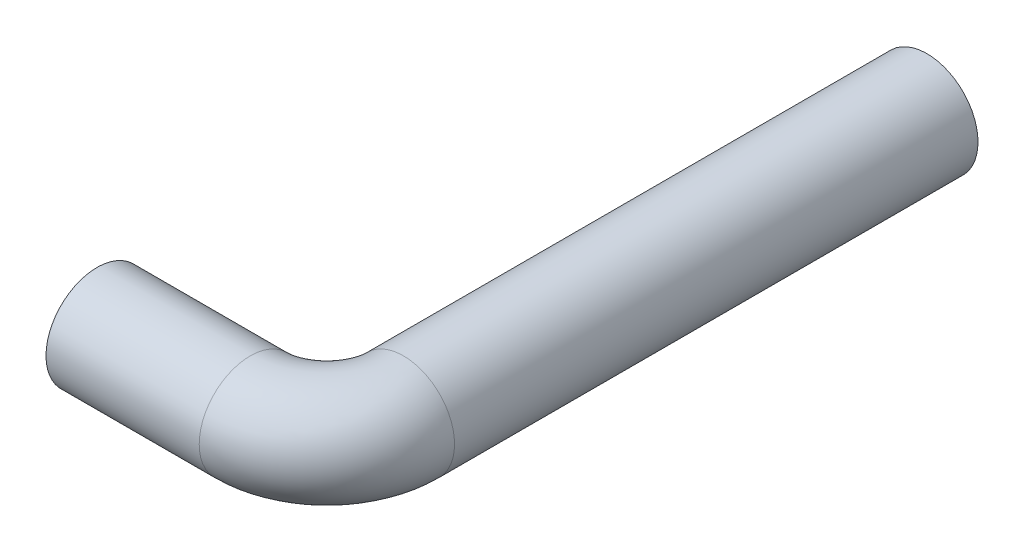
ISO-10303-21;
HEADER;
FILE_DESCRIPTION(('STEP AP214'),'2;1');
FILE_NAME('part.step','',(''),(''),'','','');
FILE_SCHEMA(('AUTOMOTIVE_DESIGN { 1 0 10303 214 1 1 1 1 }'));
ENDSEC;
DATA;
#1=APPLICATION_CONTEXT('core data for automotive mechanical design processes');
#2=APPLICATION_PROTOCOL_DEFINITION('international standard','automotive_design',2000,#1);
#3=PRODUCT_CONTEXT('',#1,'mechanical');
#4=PRODUCT('Part','Part','',(#3));
#5=PRODUCT_RELATED_PRODUCT_CATEGORY('part','',(#4));
#6=PRODUCT_DEFINITION_FORMATION('','',#4);
#7=PRODUCT_DEFINITION_CONTEXT('part definition',#1,'design');
#8=PRODUCT_DEFINITION('design','',#6,#7);
#9=PRODUCT_DEFINITION_SHAPE('','',#8);
#10=(LENGTH_UNIT() NAMED_UNIT(*) SI_UNIT(.MILLI.,.METRE.));
#11=(NAMED_UNIT(*) PLANE_ANGLE_UNIT() SI_UNIT($,.RADIAN.));
#12=(NAMED_UNIT(*) SI_UNIT($,.STERADIAN.) SOLID_ANGLE_UNIT());
#13=UNCERTAINTY_MEASURE_WITH_UNIT(LENGTH_MEASURE(1.E-05),#10,'distance_accuracy_value','');
#14=(GEOMETRIC_REPRESENTATION_CONTEXT(3) GLOBAL_UNCERTAINTY_ASSIGNED_CONTEXT((#13)) GLOBAL_UNIT_ASSIGNED_CONTEXT((#10,
#11,#12)) REPRESENTATION_CONTEXT('',''));
#15=CARTESIAN_POINT('',(0.,0.,0.));
#16=DIRECTION('',(0.,0.,1.));
#17=DIRECTION('',(1.,0.,0.));
#18=AXIS2_PLACEMENT_3D('',#15,#16,#17);
#19=CARTESIAN_POINT('',(162.,21.,95.));
#20=DIRECTION('',(-1.,0.,0.));
#21=DIRECTION('',(0.,0.,1.));
#22=AXIS2_PLACEMENT_3D('',#19,#20,#21);
#23=PLANE('',#22);
#24=CARTESIAN_POINT('',(162.,21.,95.));
#25=DIRECTION('',(-1.,0.,0.));
#26=DIRECTION('',(0.,0.,1.));
#27=AXIS2_PLACEMENT_3D('',#24,#25,#26);
#28=CIRCLE('',#27,3.);
#29=CARTESIAN_POINT('',(162.,21.,98.));
#30=VERTEX_POINT('',#29);
#31=EDGE_CURVE('E88',#30,#30,#28,.T.);
#32=ORIENTED_EDGE('',*,*,#31,.F.);
#33=EDGE_LOOP('',(#32));
#34=FACE_BOUND('',#33,.T.);
#35=CARTESIAN_POINT('',(162.,21.,95.));
#36=DIRECTION('',(-1.,0.,0.));
#37=DIRECTION('',(0.,0.,1.));
#38=AXIS2_PLACEMENT_3D('',#35,#36,#37);
#39=CIRCLE('',#38,4.);
#40=CARTESIAN_POINT('',(162.,21.,99.));
#41=VERTEX_POINT('',#40);
#42=EDGE_CURVE('E68',#41,#41,#39,.T.);
#43=ORIENTED_EDGE('',*,*,#42,.T.);
#44=EDGE_LOOP('',(#43));
#45=FACE_BOUND('',#44,.T.);
#46=ADVANCED_FACE('F52',(#34,#45),#23,.T.);
#47=CARTESIAN_POINT('',(180.,21.,48.));
#48=DIRECTION('',(0.,0.,1.));
#49=DIRECTION('',(1.,0.,0.));
#50=AXIS2_PLACEMENT_3D('',#47,#48,#49);
#51=PLANE('',#50);
#52=CARTESIAN_POINT('',(180.,21.,48.));
#53=DIRECTION('',(0.,0.,1.));
#54=DIRECTION('',(1.,0.,0.));
#55=AXIS2_PLACEMENT_3D('',#52,#53,#54);
#56=CIRCLE('',#55,3.);
#57=CARTESIAN_POINT('',(183.,21.,48.));
#58=VERTEX_POINT('',#57);
#59=EDGE_CURVE('E71',#58,#58,#56,.T.);
#60=ORIENTED_EDGE('',*,*,#59,.T.);
#61=EDGE_LOOP('',(#60));
#62=FACE_BOUND('',#61,.T.);
#63=CARTESIAN_POINT('',(180.,21.,48.));
#64=DIRECTION('',(0.,0.,1.));
#65=DIRECTION('',(1.,0.,0.));
#66=AXIS2_PLACEMENT_3D('',#63,#64,#65);
#67=CIRCLE('',#66,4.);
#68=CARTESIAN_POINT('',(184.,21.,48.));
#69=VERTEX_POINT('',#68);
#70=EDGE_CURVE('E11',#69,#69,#67,.T.);
#71=ORIENTED_EDGE('',*,*,#70,.F.);
#72=EDGE_LOOP('',(#71));
#73=FACE_BOUND('',#72,.T.);
#74=ADVANCED_FACE('F91',(#62,#73),#51,.F.);
#75=CARTESIAN_POINT('',(162.,21.,95.));
#76=DIRECTION('',(1.,0.,0.));
#77=DIRECTION('',(0.,0.,-1.));
#78=AXIS2_PLACEMENT_3D('',#75,#76,#77);
#79=CYLINDRICAL_SURFACE('',#78,4.);
#80=CARTESIAN_POINT('',(174.,21.,95.));
#81=DIRECTION('',(1.,0.,0.));
#82=DIRECTION('',(0.,0.,-1.));
#83=AXIS2_PLACEMENT_3D('',#80,#81,#82);
#84=CIRCLE('',#83,4.);
#85=CARTESIAN_POINT('',(174.,21.,99.));
#86=VERTEX_POINT('',#85);
#87=EDGE_CURVE('E63',#86,#86,#84,.F.);
#88=ORIENTED_EDGE('',*,*,#87,.T.);
#89=EDGE_LOOP('',(#88));
#90=FACE_BOUND('',#89,.T.);
#91=ORIENTED_EDGE('',*,*,#42,.F.);
#92=EDGE_LOOP('',(#91));
#93=FACE_BOUND('',#92,.T.);
#94=ADVANCED_FACE('F97',(#90,#93),#79,.T.);
#95=CARTESIAN_POINT('',(174.,21.,89.));
#96=DIRECTION('',(0.,1.,0.));
#97=DIRECTION('',(0.,0.,1.));
#98=AXIS2_PLACEMENT_3D('',#95,#96,#97);
#99=TOROIDAL_SURFACE('',#98,6.00000000000001,4.);
#100=CARTESIAN_POINT('',(180.,21.,88.9999999999992));
#101=DIRECTION('',(1.34053709034762E-13,0.,1.));
#102=DIRECTION('',(1.,0.,-1.34053709034762E-13));
#103=AXIS2_PLACEMENT_3D('',#100,#101,#102);
#104=CIRCLE('',#103,4.);
#105=CARTESIAN_POINT('',(184.,21.,88.9999999999986));
#106=VERTEX_POINT('',#105);
#107=EDGE_CURVE('E58',#106,#106,#104,.T.);
#108=CARTESIAN_POINT('',(174.,21.,89.));
#109=DIRECTION('',(0.,1.,0.));
#110=DIRECTION('',(0.,0.,1.));
#111=AXIS2_PLACEMENT_3D('',#108,#109,#110);
#112=CIRCLE('',#111,10.);
#113=EDGE_CURVE('',#86,#106,#112,.T.);
#114=ORIENTED_EDGE('',*,*,#87,.F.);
#115=ORIENTED_EDGE('',*,*,#107,.T.);
#116=ORIENTED_EDGE('',*,*,#113,.T.);
#117=ORIENTED_EDGE('',*,*,#113,.F.);
#118=EDGE_LOOP('',(#114,#116,#115,#117));
#119=FACE_BOUND('',#118,.T.);
#120=ADVANCED_FACE('F110',(#119),#99,.T.);
#121=CARTESIAN_POINT('',(180.,21.,89.));
#122=DIRECTION('',(0.,0.,-1.));
#123=DIRECTION('',(-1.,0.,0.));
#124=AXIS2_PLACEMENT_3D('',#121,#122,#123);
#125=CYLINDRICAL_SURFACE('',#124,4.);
#126=ORIENTED_EDGE('',*,*,#70,.T.);
#127=EDGE_LOOP('',(#126));
#128=FACE_BOUND('',#127,.T.);
#129=ORIENTED_EDGE('',*,*,#107,.F.);
#130=EDGE_LOOP('',(#129));
#131=FACE_BOUND('',#130,.T.);
#132=ADVANCED_FACE('F54',(#128,#131),#125,.T.);
#133=CARTESIAN_POINT('',(162.,21.,95.));
#134=DIRECTION('',(1.,0.,0.));
#135=DIRECTION('',(0.,0.,-1.));
#136=AXIS2_PLACEMENT_3D('',#133,#134,#135);
#137=CYLINDRICAL_SURFACE('',#136,3.);
#138=CARTESIAN_POINT('',(174.,21.,95.));
#139=DIRECTION('',(-1.,0.,0.));
#140=DIRECTION('',(0.,0.,1.));
#141=AXIS2_PLACEMENT_3D('',#138,#139,#140);
#142=CIRCLE('',#141,3.);
#143=CARTESIAN_POINT('',(174.,21.,98.));
#144=VERTEX_POINT('',#143);
#145=EDGE_CURVE('E81',#144,#144,#142,.T.);
#146=ORIENTED_EDGE('',*,*,#145,.F.);
#147=EDGE_LOOP('',(#146));
#148=FACE_BOUND('',#147,.T.);
#149=ORIENTED_EDGE('',*,*,#31,.T.);
#150=EDGE_LOOP('',(#149));
#151=FACE_BOUND('',#150,.T.);
#152=ADVANCED_FACE('F89',(#148,#151),#137,.F.);
#153=CARTESIAN_POINT('',(174.,21.,89.));
#154=DIRECTION('',(0.,1.,0.));
#155=DIRECTION('',(0.,0.,1.));
#156=AXIS2_PLACEMENT_3D('',#153,#154,#155);
#157=TOROIDAL_SURFACE('',#156,6.00000000000001,3.);
#158=CARTESIAN_POINT('',(180.,21.,88.9999999999996));
#159=DIRECTION('',(0.,0.,1.));
#160=DIRECTION('',(1.,0.,0.));
#161=AXIS2_PLACEMENT_3D('',#158,#159,#160);
#162=CIRCLE('',#161,3.);
#163=CARTESIAN_POINT('',(183.,21.,88.9999999999994));
#164=VERTEX_POINT('',#163);
#165=EDGE_CURVE('E76',#164,#164,#162,.T.);
#166=CARTESIAN_POINT('',(174.,21.,89.));
#167=DIRECTION('',(0.,1.,0.));
#168=DIRECTION('',(0.,0.,1.));
#169=AXIS2_PLACEMENT_3D('',#166,#167,#168);
#170=CIRCLE('',#169,9.00000000000001);
#171=EDGE_CURVE('',#144,#164,#170,.T.);
#172=ORIENTED_EDGE('',*,*,#145,.T.);
#173=ORIENTED_EDGE('',*,*,#165,.F.);
#174=ORIENTED_EDGE('',*,*,#171,.T.);
#175=ORIENTED_EDGE('',*,*,#171,.F.);
#176=EDGE_LOOP('',(#172,#174,#173,#175));
#177=FACE_BOUND('',#176,.T.);
#178=ADVANCED_FACE('F103',(#177),#157,.F.);
#179=CARTESIAN_POINT('',(180.,21.,89.));
#180=DIRECTION('',(0.,0.,-1.));
#181=DIRECTION('',(-1.,0.,0.));
#182=AXIS2_PLACEMENT_3D('',#179,#180,#181);
#183=CYLINDRICAL_SURFACE('',#182,3.);
#184=ORIENTED_EDGE('',*,*,#59,.F.);
#185=EDGE_LOOP('',(#184));
#186=FACE_BOUND('',#185,.T.);
#187=ORIENTED_EDGE('',*,*,#165,.T.);
#188=EDGE_LOOP('',(#187));
#189=FACE_BOUND('',#188,.T.);
#190=ADVANCED_FACE('F92',(#186,#189),#183,.F.);
#191=CLOSED_SHELL('',(#46,#74,#94,#120,#132,#152,#178,#190));
#192=MANIFOLD_SOLID_BREP('B2',#191);
#193=ADVANCED_BREP_SHAPE_REPRESENTATION('',(#18,#192),#14);
#194=SHAPE_DEFINITION_REPRESENTATION(#9,#193);
ENDSEC;
END-ISO-10303-21;
